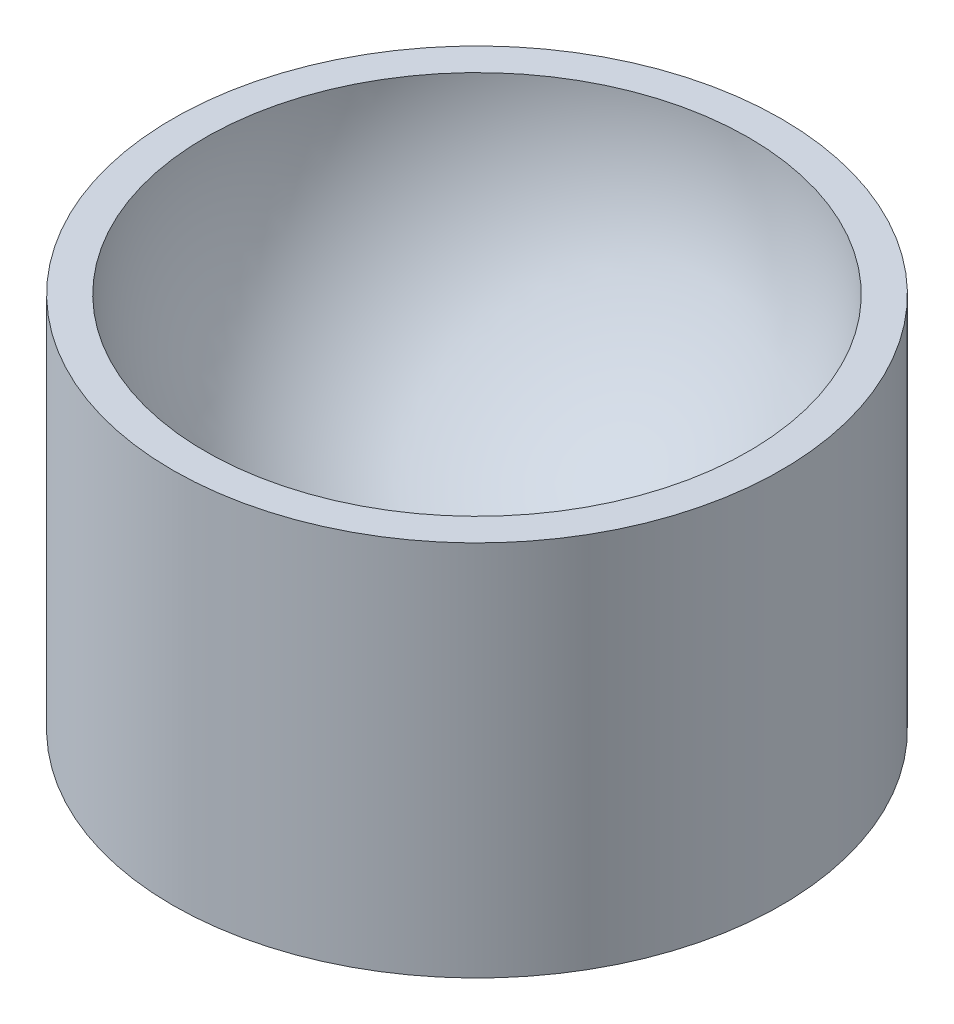
ISO-10303-21;
HEADER;
FILE_DESCRIPTION(('STEP AP214'),'2;1');
FILE_NAME('part.step','',(''),(''),'','','');
FILE_SCHEMA(('AUTOMOTIVE_DESIGN { 1 0 10303 214 1 1 1 1 }'));
ENDSEC;
DATA;
#1=APPLICATION_CONTEXT('core data for automotive mechanical design processes');
#2=APPLICATION_PROTOCOL_DEFINITION('international standard','automotive_design',2000,#1);
#3=PRODUCT_CONTEXT('',#1,'mechanical');
#4=PRODUCT('Part','Part','',(#3));
#5=PRODUCT_RELATED_PRODUCT_CATEGORY('part','',(#4));
#6=PRODUCT_DEFINITION_FORMATION('','',#4);
#7=PRODUCT_DEFINITION_CONTEXT('part definition',#1,'design');
#8=PRODUCT_DEFINITION('design','',#6,#7);
#9=PRODUCT_DEFINITION_SHAPE('','',#8);
#10=(LENGTH_UNIT() NAMED_UNIT(*) SI_UNIT(.MILLI.,.METRE.));
#11=(NAMED_UNIT(*) PLANE_ANGLE_UNIT() SI_UNIT($,.RADIAN.));
#12=(NAMED_UNIT(*) SI_UNIT($,.STERADIAN.) SOLID_ANGLE_UNIT());
#13=UNCERTAINTY_MEASURE_WITH_UNIT(LENGTH_MEASURE(1.E-05),#10,'distance_accuracy_value','');
#14=(GEOMETRIC_REPRESENTATION_CONTEXT(3) GLOBAL_UNCERTAINTY_ASSIGNED_CONTEXT((#13)) GLOBAL_UNIT_ASSIGNED_CONTEXT((#10,
#11,#12)) REPRESENTATION_CONTEXT('',''));
#15=CARTESIAN_POINT('',(0.,0.,0.));
#16=DIRECTION('',(0.,0.,1.));
#17=DIRECTION('',(1.,0.,0.));
#18=AXIS2_PLACEMENT_3D('',#15,#16,#17);
#19=CARTESIAN_POINT('',(6.5,11.5,-3.75277674973257));
#20=DIRECTION('',(-0.5,0.,0.866025403784439));
#21=DIRECTION('',(0.866025403784439,0.,0.5));
#22=AXIS2_PLACEMENT_3D('',#19,#20,#21);
#23=PLANE('',#22);
#24=DIRECTION('',(0.,-1.,0.));
#25=VECTOR('',#24,1.);
#26=CARTESIAN_POINT('',(0.,11.5,-7.50555349946514));
#27=LINE('',#26,#25);
#28=CARTESIAN_POINT('',(0.,11.5,-7.50555349946514));
#29=VERTEX_POINT('',#28);
#30=CARTESIAN_POINT('',(0.,7.,-7.50555349946514));
#31=VERTEX_POINT('',#30);
#32=EDGE_CURVE('E109',#29,#31,#27,.T.);
#33=ORIENTED_EDGE('',*,*,#32,.T.);
#34=DIRECTION('',(0.866025403784439,0.,0.5));
#35=VECTOR('',#34,1.);
#36=CARTESIAN_POINT('',(6.5,7.,-3.75277674973257));
#37=LINE('',#36,#35);
#38=CARTESIAN_POINT('',(6.5,7.,-3.75277674973257));
#39=VERTEX_POINT('',#38);
#40=EDGE_CURVE('E222',#31,#39,#37,.T.);
#41=ORIENTED_EDGE('',*,*,#40,.T.);
#42=DIRECTION('',(0.,-1.,0.));
#43=VECTOR('',#42,1.);
#44=CARTESIAN_POINT('',(6.5,11.5,-3.75277674973257));
#45=LINE('',#44,#43);
#46=CARTESIAN_POINT('',(6.5,11.5,-3.75277674973257));
#47=VERTEX_POINT('',#46);
#48=EDGE_CURVE('E238',#47,#39,#45,.T.);
#49=ORIENTED_EDGE('',*,*,#48,.F.);
#50=DIRECTION('',(-0.866025403784439,0.,-0.5));
#51=VECTOR('',#50,1.);
#52=CARTESIAN_POINT('',(6.5,11.5,-3.75277674973257));
#53=LINE('',#52,#51);
#54=EDGE_CURVE('E111',#47,#29,#53,.T.);
#55=ORIENTED_EDGE('',*,*,#54,.T.);
#56=EDGE_LOOP('',(#33,#41,#49,#55));
#57=FACE_BOUND('',#56,.T.);
#58=ADVANCED_FACE('F41',(#57),#23,.T.);
#59=CARTESIAN_POINT('',(0.,11.5,-7.50555349946514));
#60=DIRECTION('',(0.5,0.,0.866025403784439));
#61=DIRECTION('',(0.866025403784439,0.,-0.5));
#62=AXIS2_PLACEMENT_3D('',#59,#60,#61);
#63=PLANE('',#62);
#64=DIRECTION('',(0.,-1.,0.));
#65=VECTOR('',#64,1.);
#66=CARTESIAN_POINT('',(-6.5,11.5,-3.75277674973257));
#67=LINE('',#66,#65);
#68=CARTESIAN_POINT('',(-6.5,11.5,-3.75277674973257));
#69=VERTEX_POINT('',#68);
#70=CARTESIAN_POINT('',(-6.5,7.,-3.75277674973257));
#71=VERTEX_POINT('',#70);
#72=EDGE_CURVE('E107',#69,#71,#67,.T.);
#73=ORIENTED_EDGE('',*,*,#72,.T.);
#74=DIRECTION('',(0.866025403784439,0.,-0.5));
#75=VECTOR('',#74,1.);
#76=CARTESIAN_POINT('',(0.,7.,-7.50555349946514));
#77=LINE('',#76,#75);
#78=EDGE_CURVE('E219',#71,#31,#77,.T.);
#79=ORIENTED_EDGE('',*,*,#78,.T.);
#80=ORIENTED_EDGE('',*,*,#32,.F.);
#81=DIRECTION('',(-0.866025403784439,0.,0.5));
#82=VECTOR('',#81,1.);
#83=CARTESIAN_POINT('',(0.,11.5,-7.50555349946514));
#84=LINE('',#83,#82);
#85=EDGE_CURVE('E94',#29,#69,#84,.T.);
#86=ORIENTED_EDGE('',*,*,#85,.T.);
#87=EDGE_LOOP('',(#73,#79,#80,#86));
#88=FACE_BOUND('',#87,.T.);
#89=ADVANCED_FACE('F105',(#88),#63,.T.);
#90=CARTESIAN_POINT('',(-6.5,11.5,-3.75277674973257));
#91=DIRECTION('',(1.,0.,0.));
#92=DIRECTION('',(0.,0.,-1.));
#93=AXIS2_PLACEMENT_3D('',#90,#91,#92);
#94=PLANE('',#93);
#95=DIRECTION('',(0.,-1.,0.));
#96=VECTOR('',#95,1.);
#97=CARTESIAN_POINT('',(-6.5,11.5,3.75277674973257));
#98=LINE('',#97,#96);
#99=CARTESIAN_POINT('',(-6.5,11.5,3.75277674973257));
#100=VERTEX_POINT('',#99);
#101=CARTESIAN_POINT('',(-6.5,7.,3.75277674973257));
#102=VERTEX_POINT('',#101);
#103=EDGE_CURVE('E117',#100,#102,#98,.T.);
#104=ORIENTED_EDGE('',*,*,#103,.T.);
#105=DIRECTION('',(0.,0.,-1.));
#106=VECTOR('',#105,1.);
#107=CARTESIAN_POINT('',(-6.5,7.,-3.75277674973257));
#108=LINE('',#107,#106);
#109=EDGE_CURVE('E115',#102,#71,#108,.T.);
#110=ORIENTED_EDGE('',*,*,#109,.T.);
#111=ORIENTED_EDGE('',*,*,#72,.F.);
#112=DIRECTION('',(0.,0.,1.));
#113=VECTOR('',#112,1.);
#114=CARTESIAN_POINT('',(-6.5,11.5,-3.75277674973257));
#115=LINE('',#114,#113);
#116=EDGE_CURVE('E91',#69,#100,#115,.T.);
#117=ORIENTED_EDGE('',*,*,#116,.T.);
#118=EDGE_LOOP('',(#104,#110,#111,#117));
#119=FACE_BOUND('',#118,.T.);
#120=ADVANCED_FACE('F114',(#119),#94,.T.);
#121=CARTESIAN_POINT('',(-6.5,11.5,3.75277674973257));
#122=DIRECTION('',(0.5,0.,-0.866025403784439));
#123=DIRECTION('',(-0.866025403784439,0.,-0.5));
#124=AXIS2_PLACEMENT_3D('',#121,#122,#123);
#125=PLANE('',#124);
#126=DIRECTION('',(0.,-1.,0.));
#127=VECTOR('',#126,1.);
#128=CARTESIAN_POINT('',(0.,11.5,7.50555349946514));
#129=LINE('',#128,#127);
#130=CARTESIAN_POINT('',(0.,11.5,7.50555349946514));
#131=VERTEX_POINT('',#130);
#132=CARTESIAN_POINT('',(0.,7.,7.50555349946514));
#133=VERTEX_POINT('',#132);
#134=EDGE_CURVE('E122',#131,#133,#129,.T.);
#135=ORIENTED_EDGE('',*,*,#134,.T.);
#136=DIRECTION('',(-0.866025403784439,0.,-0.5));
#137=VECTOR('',#136,1.);
#138=CARTESIAN_POINT('',(-6.5,7.,3.75277674973257));
#139=LINE('',#138,#137);
#140=EDGE_CURVE('E213',#133,#102,#139,.T.);
#141=ORIENTED_EDGE('',*,*,#140,.T.);
#142=ORIENTED_EDGE('',*,*,#103,.F.);
#143=DIRECTION('',(0.866025403784439,0.,0.5));
#144=VECTOR('',#143,1.);
#145=CARTESIAN_POINT('',(-6.5,11.5,3.75277674973257));
#146=LINE('',#145,#144);
#147=EDGE_CURVE('E64',#100,#131,#146,.T.);
#148=ORIENTED_EDGE('',*,*,#147,.T.);
#149=EDGE_LOOP('',(#135,#141,#142,#148));
#150=FACE_BOUND('',#149,.T.);
#151=ADVANCED_FACE('F154',(#150),#125,.T.);
#152=CARTESIAN_POINT('',(0.,11.5,7.50555349946514));
#153=DIRECTION('',(-0.5,0.,-0.866025403784439));
#154=DIRECTION('',(-0.866025403784439,0.,0.5));
#155=AXIS2_PLACEMENT_3D('',#152,#153,#154);
#156=PLANE('',#155);
#157=DIRECTION('',(0.,-1.,0.));
#158=VECTOR('',#157,1.);
#159=CARTESIAN_POINT('',(6.5,11.5,3.75277674973257));
#160=LINE('',#159,#158);
#161=CARTESIAN_POINT('',(6.5,11.5,3.75277674973257));
#162=VERTEX_POINT('',#161);
#163=CARTESIAN_POINT('',(6.5,7.,3.75277674973257));
#164=VERTEX_POINT('',#163);
#165=EDGE_CURVE('E242',#162,#164,#160,.T.);
#166=ORIENTED_EDGE('',*,*,#165,.T.);
#167=DIRECTION('',(-0.866025403784439,0.,0.5));
#168=VECTOR('',#167,1.);
#169=CARTESIAN_POINT('',(0.,7.,7.50555349946514));
#170=LINE('',#169,#168);
#171=EDGE_CURVE('E57',#164,#133,#170,.T.);
#172=ORIENTED_EDGE('',*,*,#171,.T.);
#173=ORIENTED_EDGE('',*,*,#134,.F.);
#174=DIRECTION('',(0.866025403784439,0.,-0.5));
#175=VECTOR('',#174,1.);
#176=CARTESIAN_POINT('',(0.,11.5,7.50555349946514));
#177=LINE('',#176,#175);
#178=EDGE_CURVE('E230',#131,#162,#177,.T.);
#179=ORIENTED_EDGE('',*,*,#178,.T.);
#180=EDGE_LOOP('',(#166,#172,#173,#179));
#181=FACE_BOUND('',#180,.T.);
#182=ADVANCED_FACE('F140',(#181),#156,.T.);
#183=CARTESIAN_POINT('',(6.5,11.5,3.75277674973257));
#184=DIRECTION('',(-1.,0.,0.));
#185=DIRECTION('',(0.,0.,1.));
#186=AXIS2_PLACEMENT_3D('',#183,#184,#185);
#187=PLANE('',#186);
#188=ORIENTED_EDGE('',*,*,#48,.T.);
#189=DIRECTION('',(0.,0.,1.));
#190=VECTOR('',#189,1.);
#191=CARTESIAN_POINT('',(6.5,7.,3.75277674973257));
#192=LINE('',#191,#190);
#193=EDGE_CURVE('E11',#39,#164,#192,.T.);
#194=ORIENTED_EDGE('',*,*,#193,.T.);
#195=ORIENTED_EDGE('',*,*,#165,.F.);
#196=DIRECTION('',(0.,0.,-1.));
#197=VECTOR('',#196,1.);
#198=CARTESIAN_POINT('',(6.5,11.5,3.75277674973257));
#199=LINE('',#198,#197);
#200=EDGE_CURVE('E234',#162,#47,#199,.T.);
#201=ORIENTED_EDGE('',*,*,#200,.T.);
#202=EDGE_LOOP('',(#188,#194,#195,#201));
#203=FACE_BOUND('',#202,.T.);
#204=ADVANCED_FACE('F133',(#203),#187,.T.);
#205=CARTESIAN_POINT('',(0.,0.,0.));
#206=DIRECTION('',(0.,1.,0.));
#207=DIRECTION('',(0.,0.,1.));
#208=AXIS2_PLACEMENT_3D('',#205,#206,#207);
#209=PLANE('',#208);
#210=CARTESIAN_POINT('',(0.,0.,0.));
#211=DIRECTION('',(0.,-1.,0.));
#212=DIRECTION('',(0.,0.,-1.));
#213=AXIS2_PLACEMENT_3D('',#210,#211,#212);
#214=CIRCLE('',#213,8.);
#215=CARTESIAN_POINT('',(0.,0.,-8.));
#216=VERTEX_POINT('',#215);
#217=EDGE_CURVE('E203',#216,#216,#214,.T.);
#218=ORIENTED_EDGE('',*,*,#217,.F.);
#219=EDGE_LOOP('',(#218));
#220=FACE_BOUND('',#219,.T.);
#221=CARTESIAN_POINT('',(0.,0.,0.));
#222=DIRECTION('',(0.,1.,0.));
#223=DIRECTION('',(0.,0.,1.));
#224=AXIS2_PLACEMENT_3D('',#221,#222,#223);
#225=CIRCLE('',#224,42.);
#226=CARTESIAN_POINT('',(0.,0.,42.));
#227=VERTEX_POINT('',#226);
#228=EDGE_CURVE('E50',#227,#227,#225,.T.);
#229=ORIENTED_EDGE('',*,*,#228,.F.);
#230=EDGE_LOOP('',(#229));
#231=FACE_BOUND('',#230,.T.);
#232=ADVANCED_FACE('F131',(#220,#231),#209,.F.);
#233=CARTESIAN_POINT('',(0.,11.5,0.));
#234=DIRECTION('',(0.,-1.,0.));
#235=DIRECTION('',(0.,0.,-1.));
#236=AXIS2_PLACEMENT_3D('',#233,#234,#235);
#237=CYLINDRICAL_SURFACE('',#236,42.);
#238=ORIENTED_EDGE('',*,*,#228,.T.);
#239=EDGE_LOOP('',(#238));
#240=FACE_BOUND('',#239,.T.);
#241=CARTESIAN_POINT('',(0.,52.,0.));
#242=DIRECTION('',(0.,-1.,0.));
#243=DIRECTION('',(0.,0.,-1.));
#244=AXIS2_PLACEMENT_3D('',#241,#242,#243);
#245=CIRCLE('',#244,42.);
#246=CARTESIAN_POINT('',(0.,52.,-42.));
#247=VERTEX_POINT('',#246);
#248=EDGE_CURVE('E189',#247,#247,#245,.T.);
#249=ORIENTED_EDGE('',*,*,#248,.T.);
#250=EDGE_LOOP('',(#249));
#251=FACE_BOUND('',#250,.T.);
#252=ADVANCED_FACE('F43',(#240,#251),#237,.T.);
#253=CARTESIAN_POINT('',(0.,7.,0.));
#254=DIRECTION('',(0.,-1.,0.));
#255=DIRECTION('',(0.,0.,-1.));
#256=AXIS2_PLACEMENT_3D('',#253,#254,#255);
#257=CYLINDRICAL_SURFACE('',#256,8.);
#258=CARTESIAN_POINT('',(0.,7.,0.));
#259=DIRECTION('',(0.,-1.,0.));
#260=DIRECTION('',(0.,0.,-1.));
#261=AXIS2_PLACEMENT_3D('',#258,#259,#260);
#262=CIRCLE('',#261,8.);
#263=CARTESIAN_POINT('',(0.,7.,-8.));
#264=VERTEX_POINT('',#263);
#265=EDGE_CURVE('E204',#264,#264,#262,.T.);
#266=ORIENTED_EDGE('',*,*,#265,.F.);
#267=EDGE_LOOP('',(#266));
#268=FACE_BOUND('',#267,.T.);
#269=ORIENTED_EDGE('',*,*,#217,.T.);
#270=EDGE_LOOP('',(#269));
#271=FACE_BOUND('',#270,.T.);
#272=ADVANCED_FACE('F139',(#268,#271),#257,.F.);
#273=CARTESIAN_POINT('',(0.,7.,0.));
#274=DIRECTION('',(0.,-1.,0.));
#275=DIRECTION('',(0.,0.,-1.));
#276=AXIS2_PLACEMENT_3D('',#273,#274,#275);
#277=PLANE('',#276);
#278=ORIENTED_EDGE('',*,*,#78,.F.);
#279=ORIENTED_EDGE('',*,*,#109,.F.);
#280=ORIENTED_EDGE('',*,*,#140,.F.);
#281=ORIENTED_EDGE('',*,*,#171,.F.);
#282=ORIENTED_EDGE('',*,*,#193,.F.);
#283=ORIENTED_EDGE('',*,*,#40,.F.);
#284=EDGE_LOOP('',(#278,#279,#280,#281,#282,#283));
#285=FACE_BOUND('',#284,.T.);
#286=ORIENTED_EDGE('',*,*,#265,.T.);
#287=EDGE_LOOP('',(#286));
#288=FACE_BOUND('',#287,.T.);
#289=ADVANCED_FACE('F163',(#285,#288),#277,.T.);
#290=CARTESIAN_POINT('',(4.05000000000001,11.5,0.));
#291=DIRECTION('',(0.,-1.,0.));
#292=DIRECTION('',(0.,0.,-1.));
#293=AXIS2_PLACEMENT_3D('',#290,#291,#292);
#294=PLANE('',#293);
#295=CARTESIAN_POINT('',(0.,11.5,0.));
#296=DIRECTION('',(0.,-1.,0.));
#297=DIRECTION('',(0.,0.,-1.));
#298=AXIS2_PLACEMENT_3D('',#295,#296,#297);
#299=CIRCLE('',#298,4.05000000000001);
#300=CARTESIAN_POINT('',(0.,11.5,-4.05000000000001));
#301=VERTEX_POINT('',#300);
#302=EDGE_CURVE('E191',#301,#301,#299,.T.);
#303=ORIENTED_EDGE('',*,*,#302,.F.);
#304=EDGE_LOOP('',(#303));
#305=FACE_BOUND('',#304,.T.);
#306=ORIENTED_EDGE('',*,*,#85,.F.);
#307=ORIENTED_EDGE('',*,*,#54,.F.);
#308=ORIENTED_EDGE('',*,*,#200,.F.);
#309=ORIENTED_EDGE('',*,*,#178,.F.);
#310=ORIENTED_EDGE('',*,*,#147,.F.);
#311=ORIENTED_EDGE('',*,*,#116,.F.);
#312=EDGE_LOOP('',(#306,#307,#308,#309,#310,#311));
#313=FACE_BOUND('',#312,.T.);
#314=ADVANCED_FACE('F93',(#305,#313),#294,.T.);
#315=CARTESIAN_POINT('',(0.,52.,0.));
#316=DIRECTION('',(0.,-1.,0.));
#317=DIRECTION('',(1.,0.,0.));
#318=AXIS2_PLACEMENT_3D('',#315,#316,#317);
#319=SPHERICAL_SURFACE('',#318,37.5);
#320=CARTESIAN_POINT('',(0.,14.7193414757733,0.));
#321=DIRECTION('',(0.,-1.,0.));
#322=DIRECTION('',(0.,0.,-1.));
#323=AXIS2_PLACEMENT_3D('',#320,#321,#322);
#324=CIRCLE('',#323,4.05);
#325=CARTESIAN_POINT('',(0.,14.7193414757733,-4.05));
#326=VERTEX_POINT('',#325);
#327=EDGE_CURVE('E196',#326,#326,#324,.T.);
#328=ORIENTED_EDGE('',*,*,#327,.T.);
#329=EDGE_LOOP('',(#328));
#330=FACE_BOUND('',#329,.T.);
#331=CARTESIAN_POINT('',(0.,52.,0.));
#332=DIRECTION('',(0.,-1.,0.));
#333=DIRECTION('',(0.,0.,-1.));
#334=AXIS2_PLACEMENT_3D('',#331,#332,#333);
#335=CIRCLE('',#334,37.5);
#336=CARTESIAN_POINT('',(0.,52.,-37.5));
#337=VERTEX_POINT('',#336);
#338=EDGE_CURVE('E186',#337,#337,#335,.T.);
#339=ORIENTED_EDGE('',*,*,#338,.F.);
#340=EDGE_LOOP('',(#339));
#341=FACE_BOUND('',#340,.T.);
#342=ADVANCED_FACE('F167',(#330,#341),#319,.F.);
#343=CARTESIAN_POINT('',(0.,0.,0.));
#344=DIRECTION('',(0.,-1.,0.));
#345=DIRECTION('',(0.,0.,-1.));
#346=AXIS2_PLACEMENT_3D('',#343,#344,#345);
#347=CYLINDRICAL_SURFACE('',#346,4.05);
#348=ORIENTED_EDGE('',*,*,#302,.T.);
#349=EDGE_LOOP('',(#348));
#350=FACE_BOUND('',#349,.T.);
#351=ORIENTED_EDGE('',*,*,#327,.F.);
#352=EDGE_LOOP('',(#351));
#353=FACE_BOUND('',#352,.T.);
#354=ADVANCED_FACE('F170',(#350,#353),#347,.F.);
#355=CARTESIAN_POINT('',(42.,52.,0.));
#356=DIRECTION('',(0.,1.,0.));
#357=DIRECTION('',(0.,0.,1.));
#358=AXIS2_PLACEMENT_3D('',#355,#356,#357);
#359=PLANE('',#358);
#360=ORIENTED_EDGE('',*,*,#338,.T.);
#361=EDGE_LOOP('',(#360));
#362=FACE_BOUND('',#361,.T.);
#363=ORIENTED_EDGE('',*,*,#248,.F.);
#364=EDGE_LOOP('',(#363));
#365=FACE_BOUND('',#364,.T.);
#366=ADVANCED_FACE('F174',(#362,#365),#359,.T.);
#367=CLOSED_SHELL('',(#58,#89,#120,#151,#182,#204,#232,#252,#272,#289,#314,#342,#354,#366));
#368=MANIFOLD_SOLID_BREP('B2',#367);
#369=ADVANCED_BREP_SHAPE_REPRESENTATION('',(#18,#368),#14);
#370=SHAPE_DEFINITION_REPRESENTATION(#9,#369);
ENDSEC;
END-ISO-10303-21;
